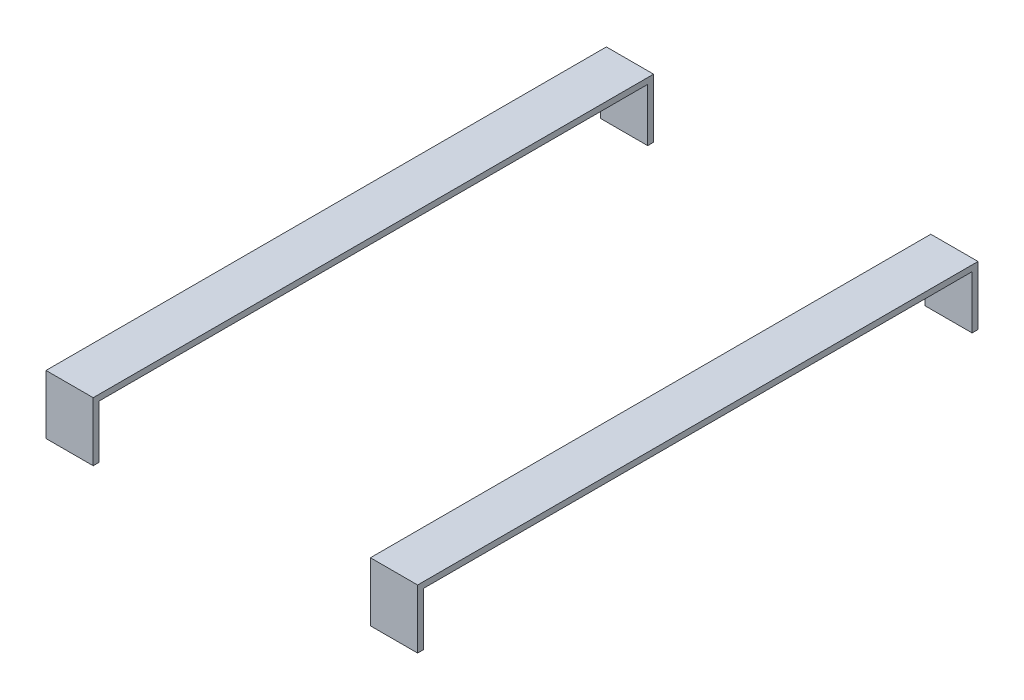
ISO-10303-21;
HEADER;
FILE_DESCRIPTION(('STEP AP214'),'2;1');
FILE_NAME('part.step','',(''),(''),'','','');
FILE_SCHEMA(('AUTOMOTIVE_DESIGN { 1 0 10303 214 1 1 1 1 }'));
ENDSEC;
DATA;
#1=APPLICATION_CONTEXT('core data for automotive mechanical design processes');
#2=APPLICATION_PROTOCOL_DEFINITION('international standard','automotive_design',2000,#1);
#3=PRODUCT_CONTEXT('',#1,'mechanical');
#4=PRODUCT('Part','Part','',(#3));
#5=PRODUCT_RELATED_PRODUCT_CATEGORY('part','',(#4));
#6=PRODUCT_DEFINITION_FORMATION('','',#4);
#7=PRODUCT_DEFINITION_CONTEXT('part definition',#1,'design');
#8=PRODUCT_DEFINITION('design','',#6,#7);
#9=PRODUCT_DEFINITION_SHAPE('','',#8);
#10=(LENGTH_UNIT() NAMED_UNIT(*) SI_UNIT(.MILLI.,.METRE.));
#11=(NAMED_UNIT(*) PLANE_ANGLE_UNIT() SI_UNIT($,.RADIAN.));
#12=(NAMED_UNIT(*) SI_UNIT($,.STERADIAN.) SOLID_ANGLE_UNIT());
#13=UNCERTAINTY_MEASURE_WITH_UNIT(LENGTH_MEASURE(1.E-05),#10,'distance_accuracy_value','');
#14=(GEOMETRIC_REPRESENTATION_CONTEXT(3) GLOBAL_UNCERTAINTY_ASSIGNED_CONTEXT((#13)) GLOBAL_UNIT_ASSIGNED_CONTEXT((#10,
#11,#12)) REPRESENTATION_CONTEXT('',''));
#15=CARTESIAN_POINT('',(0.,0.,0.));
#16=DIRECTION('',(0.,0.,1.));
#17=DIRECTION('',(1.,0.,0.));
#18=AXIS2_PLACEMENT_3D('',#15,#16,#17);
#19=CARTESIAN_POINT('',(470.,100.,10.));
#20=DIRECTION('',(0.,0.,-1.));
#21=DIRECTION('',(-1.,0.,0.));
#22=AXIS2_PLACEMENT_3D('',#19,#20,#21);
#23=PLANE('',#22);
#24=DIRECTION('',(1.,0.,0.));
#25=VECTOR('',#24,1.);
#26=CARTESIAN_POINT('',(470.,90.,10.));
#27=LINE('',#26,#25);
#28=CARTESIAN_POINT('',(470.,90.,10.));
#29=VERTEX_POINT('',#28);
#30=CARTESIAN_POINT('',(550.,90.,10.));
#31=VERTEX_POINT('',#30);
#32=EDGE_CURVE('E60',#29,#31,#27,.T.);
#33=ORIENTED_EDGE('',*,*,#32,.F.);
#34=DIRECTION('',(0.,-1.,0.));
#35=VECTOR('',#34,1.);
#36=CARTESIAN_POINT('',(470.,100.,10.));
#37=LINE('',#36,#35);
#38=CARTESIAN_POINT('',(470.,0.,10.));
#39=VERTEX_POINT('',#38);
#40=EDGE_CURVE('E95',#29,#39,#37,.T.);
#41=ORIENTED_EDGE('',*,*,#40,.T.);
#42=DIRECTION('',(1.,0.,0.));
#43=VECTOR('',#42,1.);
#44=CARTESIAN_POINT('',(470.,0.,10.));
#45=LINE('',#44,#43);
#46=CARTESIAN_POINT('',(550.,0.,10.));
#47=VERTEX_POINT('',#46);
#48=EDGE_CURVE('E99',#39,#47,#45,.T.);
#49=ORIENTED_EDGE('',*,*,#48,.T.);
#50=DIRECTION('',(0.,-1.,0.));
#51=VECTOR('',#50,1.);
#52=CARTESIAN_POINT('',(550.,100.,10.));
#53=LINE('',#52,#51);
#54=EDGE_CURVE('E87',#31,#47,#53,.T.);
#55=ORIENTED_EDGE('',*,*,#54,.F.);
#56=EDGE_LOOP('',(#33,#41,#49,#55));
#57=FACE_BOUND('',#56,.T.);
#58=ADVANCED_FACE('F45',(#57),#23,.F.);
#59=CARTESIAN_POINT('',(550.,100.,0.));
#60=DIRECTION('',(-1.,0.,0.));
#61=DIRECTION('',(0.,0.,1.));
#62=AXIS2_PLACEMENT_3D('',#59,#60,#61);
#63=PLANE('',#62);
#64=DIRECTION('',(0.,0.,-1.));
#65=VECTOR('',#64,1.);
#66=CARTESIAN_POINT('',(550.,0.,0.));
#67=LINE('',#66,#65);
#68=CARTESIAN_POINT('',(550.,0.,0.));
#69=VERTEX_POINT('',#68);
#70=EDGE_CURVE('E91',#47,#69,#67,.T.);
#71=ORIENTED_EDGE('',*,*,#70,.T.);
#72=DIRECTION('',(0.,-1.,0.));
#73=VECTOR('',#72,1.);
#74=CARTESIAN_POINT('',(550.,100.,0.));
#75=LINE('',#74,#73);
#76=CARTESIAN_POINT('',(550.,100.,0.));
#77=VERTEX_POINT('',#76);
#78=EDGE_CURVE('E12',#77,#69,#75,.T.);
#79=ORIENTED_EDGE('',*,*,#78,.F.);
#80=DIRECTION('',(0.,0.,-1.));
#81=VECTOR('',#80,1.);
#82=CARTESIAN_POINT('',(550.,100.,0.));
#83=LINE('',#82,#81);
#84=CARTESIAN_POINT('',(550.,100.,950.));
#85=VERTEX_POINT('',#84);
#86=EDGE_CURVE('E103',#85,#77,#83,.T.);
#87=ORIENTED_EDGE('',*,*,#86,.F.);
#88=DIRECTION('',(0.,-1.,0.));
#89=VECTOR('',#88,1.);
#90=CARTESIAN_POINT('',(550.,100.,950.));
#91=LINE('',#90,#89);
#92=CARTESIAN_POINT('',(550.,0.,950.));
#93=VERTEX_POINT('',#92);
#94=EDGE_CURVE('E131',#85,#93,#91,.T.);
#95=ORIENTED_EDGE('',*,*,#94,.T.);
#96=DIRECTION('',(0.,0.,-1.));
#97=VECTOR('',#96,1.);
#98=CARTESIAN_POINT('',(550.,0.,950.));
#99=LINE('',#98,#97);
#100=CARTESIAN_POINT('',(550.,0.,940.));
#101=VERTEX_POINT('',#100);
#102=EDGE_CURVE('E179',#93,#101,#99,.T.);
#103=ORIENTED_EDGE('',*,*,#102,.T.);
#104=DIRECTION('',(0.,-1.,0.));
#105=VECTOR('',#104,1.);
#106=CARTESIAN_POINT('',(550.,100.,940.));
#107=LINE('',#106,#105);
#108=CARTESIAN_POINT('',(550.,90.,940.));
#109=VERTEX_POINT('',#108);
#110=EDGE_CURVE('E149',#109,#101,#107,.T.);
#111=ORIENTED_EDGE('',*,*,#110,.F.);
#112=DIRECTION('',(0.,0.,-1.));
#113=VECTOR('',#112,1.);
#114=CARTESIAN_POINT('',(550.,90.,1020.62257748299));
#115=LINE('',#114,#113);
#116=EDGE_CURVE('E94',#109,#31,#115,.T.);
#117=ORIENTED_EDGE('',*,*,#116,.T.);
#118=ORIENTED_EDGE('',*,*,#54,.T.);
#119=EDGE_LOOP('',(#71,#79,#87,#95,#103,#111,#117,#118));
#120=FACE_BOUND('',#119,.T.);
#121=ADVANCED_FACE('F47',(#120),#63,.F.);
#122=CARTESIAN_POINT('',(470.,100.,0.));
#123=DIRECTION('',(0.,0.,1.));
#124=DIRECTION('',(1.,0.,0.));
#125=AXIS2_PLACEMENT_3D('',#122,#123,#124);
#126=PLANE('',#125);
#127=DIRECTION('',(-1.,0.,0.));
#128=VECTOR('',#127,1.);
#129=CARTESIAN_POINT('',(470.,0.,0.));
#130=LINE('',#129,#128);
#131=CARTESIAN_POINT('',(470.,0.,0.));
#132=VERTEX_POINT('',#131);
#133=EDGE_CURVE('E107',#69,#132,#130,.T.);
#134=ORIENTED_EDGE('',*,*,#133,.T.);
#135=DIRECTION('',(0.,-1.,0.));
#136=VECTOR('',#135,1.);
#137=CARTESIAN_POINT('',(470.,100.,0.));
#138=LINE('',#137,#136);
#139=CARTESIAN_POINT('',(470.,100.,0.));
#140=VERTEX_POINT('',#139);
#141=EDGE_CURVE('E53',#140,#132,#138,.T.);
#142=ORIENTED_EDGE('',*,*,#141,.F.);
#143=DIRECTION('',(-1.,0.,0.));
#144=VECTOR('',#143,1.);
#145=CARTESIAN_POINT('',(470.,100.,0.));
#146=LINE('',#145,#144);
#147=EDGE_CURVE('E69',#77,#140,#146,.T.);
#148=ORIENTED_EDGE('',*,*,#147,.F.);
#149=ORIENTED_EDGE('',*,*,#78,.T.);
#150=EDGE_LOOP('',(#134,#142,#148,#149));
#151=FACE_BOUND('',#150,.T.);
#152=ADVANCED_FACE('F123',(#151),#126,.F.);
#153=CARTESIAN_POINT('',(470.,100.,0.));
#154=DIRECTION('',(1.,0.,0.));
#155=DIRECTION('',(0.,0.,-1.));
#156=AXIS2_PLACEMENT_3D('',#153,#154,#155);
#157=PLANE('',#156);
#158=DIRECTION('',(0.,0.,1.));
#159=VECTOR('',#158,1.);
#160=CARTESIAN_POINT('',(470.,0.,0.));
#161=LINE('',#160,#159);
#162=EDGE_CURVE('E104',#132,#39,#161,.T.);
#163=ORIENTED_EDGE('',*,*,#162,.T.);
#164=ORIENTED_EDGE('',*,*,#40,.F.);
#165=DIRECTION('',(0.,0.,-1.));
#166=VECTOR('',#165,1.);
#167=CARTESIAN_POINT('',(470.,90.,1020.62257748299));
#168=LINE('',#167,#166);
#169=CARTESIAN_POINT('',(470.,90.,940.));
#170=VERTEX_POINT('',#169);
#171=EDGE_CURVE('E148',#170,#29,#168,.T.);
#172=ORIENTED_EDGE('',*,*,#171,.F.);
#173=DIRECTION('',(0.,-1.,0.));
#174=VECTOR('',#173,1.);
#175=CARTESIAN_POINT('',(470.,100.,940.));
#176=LINE('',#175,#174);
#177=CARTESIAN_POINT('',(470.,0.,940.));
#178=VERTEX_POINT('',#177);
#179=EDGE_CURVE('E154',#170,#178,#176,.T.);
#180=ORIENTED_EDGE('',*,*,#179,.T.);
#181=DIRECTION('',(0.,0.,1.));
#182=VECTOR('',#181,1.);
#183=CARTESIAN_POINT('',(470.,0.,950.));
#184=LINE('',#183,#182);
#185=CARTESIAN_POINT('',(470.,0.,950.));
#186=VERTEX_POINT('',#185);
#187=EDGE_CURVE('E143',#178,#186,#184,.T.);
#188=ORIENTED_EDGE('',*,*,#187,.T.);
#189=DIRECTION('',(0.,-1.,0.));
#190=VECTOR('',#189,1.);
#191=CARTESIAN_POINT('',(470.,100.,950.));
#192=LINE('',#191,#190);
#193=CARTESIAN_POINT('',(470.,100.,950.));
#194=VERTEX_POINT('',#193);
#195=EDGE_CURVE('E142',#194,#186,#192,.T.);
#196=ORIENTED_EDGE('',*,*,#195,.F.);
#197=DIRECTION('',(0.,0.,1.));
#198=VECTOR('',#197,1.);
#199=CARTESIAN_POINT('',(470.,100.,0.));
#200=LINE('',#199,#198);
#201=EDGE_CURVE('E96',#140,#194,#200,.T.);
#202=ORIENTED_EDGE('',*,*,#201,.F.);
#203=ORIENTED_EDGE('',*,*,#141,.T.);
#204=EDGE_LOOP('',(#163,#164,#172,#180,#188,#196,#202,#203));
#205=FACE_BOUND('',#204,.T.);
#206=ADVANCED_FACE('F120',(#205),#157,.F.);
#207=CARTESIAN_POINT('',(0.,100.,0.));
#208=DIRECTION('',(0.,1.,0.));
#209=DIRECTION('',(0.,0.,1.));
#210=AXIS2_PLACEMENT_3D('',#207,#208,#209);
#211=PLANE('',#210);
#212=ORIENTED_EDGE('',*,*,#86,.T.);
#213=ORIENTED_EDGE('',*,*,#147,.T.);
#214=ORIENTED_EDGE('',*,*,#201,.T.);
#215=DIRECTION('',(1.,0.,0.));
#216=VECTOR('',#215,1.);
#217=CARTESIAN_POINT('',(470.,100.,950.));
#218=LINE('',#217,#216);
#219=EDGE_CURVE('E138',#194,#85,#218,.T.);
#220=ORIENTED_EDGE('',*,*,#219,.T.);
#221=EDGE_LOOP('',(#212,#213,#214,#220));
#222=FACE_BOUND('',#221,.T.);
#223=ADVANCED_FACE('F139',(#222),#211,.T.);
#224=CARTESIAN_POINT('',(0.,0.,0.));
#225=DIRECTION('',(0.,1.,0.));
#226=DIRECTION('',(0.,0.,1.));
#227=AXIS2_PLACEMENT_3D('',#224,#225,#226);
#228=PLANE('',#227);
#229=ORIENTED_EDGE('',*,*,#70,.F.);
#230=ORIENTED_EDGE('',*,*,#48,.F.);
#231=ORIENTED_EDGE('',*,*,#162,.F.);
#232=ORIENTED_EDGE('',*,*,#133,.F.);
#233=EDGE_LOOP('',(#229,#230,#231,#232));
#234=FACE_BOUND('',#233,.T.);
#235=ADVANCED_FACE('F106',(#234),#228,.F.);
#236=CARTESIAN_POINT('',(470.,90.,1020.62257748299));
#237=DIRECTION('',(0.,1.,0.));
#238=DIRECTION('',(-1.,0.,0.));
#239=AXIS2_PLACEMENT_3D('',#236,#237,#238);
#240=PLANE('',#239);
#241=DIRECTION('',(1.,0.,0.));
#242=VECTOR('',#241,1.);
#243=CARTESIAN_POINT('',(470.,90.,940.));
#244=LINE('',#243,#242);
#245=EDGE_CURVE('E108',#170,#109,#244,.T.);
#246=ORIENTED_EDGE('',*,*,#245,.F.);
#247=ORIENTED_EDGE('',*,*,#171,.T.);
#248=ORIENTED_EDGE('',*,*,#32,.T.);
#249=ORIENTED_EDGE('',*,*,#116,.F.);
#250=EDGE_LOOP('',(#246,#247,#248,#249));
#251=FACE_BOUND('',#250,.T.);
#252=ADVANCED_FACE('F161',(#251),#240,.F.);
#253=CARTESIAN_POINT('',(470.,100.,940.));
#254=DIRECTION('',(0.,0.,1.));
#255=DIRECTION('',(1.,0.,0.));
#256=AXIS2_PLACEMENT_3D('',#253,#254,#255);
#257=PLANE('',#256);
#258=ORIENTED_EDGE('',*,*,#179,.F.);
#259=ORIENTED_EDGE('',*,*,#245,.T.);
#260=ORIENTED_EDGE('',*,*,#110,.T.);
#261=DIRECTION('',(-1.,0.,0.));
#262=VECTOR('',#261,1.);
#263=CARTESIAN_POINT('',(470.,0.,940.));
#264=LINE('',#263,#262);
#265=EDGE_CURVE('E183',#101,#178,#264,.T.);
#266=ORIENTED_EDGE('',*,*,#265,.T.);
#267=EDGE_LOOP('',(#258,#259,#260,#266));
#268=FACE_BOUND('',#267,.T.);
#269=ADVANCED_FACE('F191',(#268),#257,.F.);
#270=CARTESIAN_POINT('',(470.,100.,950.));
#271=DIRECTION('',(0.,0.,-1.));
#272=DIRECTION('',(-1.,0.,0.));
#273=AXIS2_PLACEMENT_3D('',#270,#271,#272);
#274=PLANE('',#273);
#275=DIRECTION('',(1.,0.,0.));
#276=VECTOR('',#275,1.);
#277=CARTESIAN_POINT('',(470.,0.,950.));
#278=LINE('',#277,#276);
#279=EDGE_CURVE('E147',#186,#93,#278,.T.);
#280=ORIENTED_EDGE('',*,*,#279,.T.);
#281=ORIENTED_EDGE('',*,*,#94,.F.);
#282=ORIENTED_EDGE('',*,*,#219,.F.);
#283=ORIENTED_EDGE('',*,*,#195,.T.);
#284=EDGE_LOOP('',(#280,#281,#282,#283));
#285=FACE_BOUND('',#284,.T.);
#286=ADVANCED_FACE('F145',(#285),#274,.F.);
#287=CARTESIAN_POINT('',(0.,0.,0.));
#288=DIRECTION('',(0.,1.,0.));
#289=DIRECTION('',(0.,0.,1.));
#290=AXIS2_PLACEMENT_3D('',#287,#288,#289);
#291=PLANE('',#290);
#292=ORIENTED_EDGE('',*,*,#279,.F.);
#293=ORIENTED_EDGE('',*,*,#187,.F.);
#294=ORIENTED_EDGE('',*,*,#265,.F.);
#295=ORIENTED_EDGE('',*,*,#102,.F.);
#296=EDGE_LOOP('',(#292,#293,#294,#295));
#297=FACE_BOUND('',#296,.T.);
#298=ADVANCED_FACE('F180',(#297),#291,.F.);
#299=CLOSED_SHELL('',(#58,#121,#152,#206,#223,#235,#252,#269,#286,#298));
#300=MANIFOLD_SOLID_BREP('B2',#299);
#301=CARTESIAN_POINT('',(0.,100.,10.));
#302=DIRECTION('',(0.,0.,-1.));
#303=DIRECTION('',(-1.,0.,0.));
#304=AXIS2_PLACEMENT_3D('',#301,#302,#303);
#305=PLANE('',#304);
#306=DIRECTION('',(1.,0.,0.));
#307=VECTOR('',#306,1.);
#308=CARTESIAN_POINT('',(-80.,90.,10.));
#309=LINE('',#308,#307);
#310=CARTESIAN_POINT('',(-80.,90.,10.));
#311=VERTEX_POINT('',#310);
#312=CARTESIAN_POINT('',(0.,90.,10.));
#313=VERTEX_POINT('',#312);
#314=EDGE_CURVE('E306',#311,#313,#309,.T.);
#315=ORIENTED_EDGE('',*,*,#314,.F.);
#316=DIRECTION('',(0.,-1.,0.));
#317=VECTOR('',#316,1.);
#318=CARTESIAN_POINT('',(-80.,100.,10.));
#319=LINE('',#318,#317);
#320=CARTESIAN_POINT('',(-80.,0.,10.));
#321=VERTEX_POINT('',#320);
#322=EDGE_CURVE('E341',#311,#321,#319,.T.);
#323=ORIENTED_EDGE('',*,*,#322,.T.);
#324=DIRECTION('',(1.,0.,0.));
#325=VECTOR('',#324,1.);
#326=CARTESIAN_POINT('',(0.,0.,10.));
#327=LINE('',#326,#325);
#328=CARTESIAN_POINT('',(0.,0.,10.));
#329=VERTEX_POINT('',#328);
#330=EDGE_CURVE('E345',#321,#329,#327,.T.);
#331=ORIENTED_EDGE('',*,*,#330,.T.);
#332=DIRECTION('',(0.,-1.,0.));
#333=VECTOR('',#332,1.);
#334=CARTESIAN_POINT('',(0.,100.,10.));
#335=LINE('',#334,#333);
#336=EDGE_CURVE('E333',#313,#329,#335,.T.);
#337=ORIENTED_EDGE('',*,*,#336,.F.);
#338=EDGE_LOOP('',(#315,#323,#331,#337));
#339=FACE_BOUND('',#338,.T.);
#340=ADVANCED_FACE('F291',(#339),#305,.F.);
#341=CARTESIAN_POINT('',(0.,100.,0.));
#342=DIRECTION('',(-1.,0.,0.));
#343=DIRECTION('',(0.,0.,1.));
#344=AXIS2_PLACEMENT_3D('',#341,#342,#343);
#345=PLANE('',#344);
#346=DIRECTION('',(0.,0.,-1.));
#347=VECTOR('',#346,1.);
#348=CARTESIAN_POINT('',(0.,0.,0.));
#349=LINE('',#348,#347);
#350=CARTESIAN_POINT('',(0.,0.,0.));
#351=VERTEX_POINT('',#350);
#352=EDGE_CURVE('E337',#329,#351,#349,.T.);
#353=ORIENTED_EDGE('',*,*,#352,.T.);
#354=DIRECTION('',(0.,-1.,0.));
#355=VECTOR('',#354,1.);
#356=CARTESIAN_POINT('',(0.,100.,0.));
#357=LINE('',#356,#355);
#358=CARTESIAN_POINT('',(0.,100.,0.));
#359=VERTEX_POINT('',#358);
#360=EDGE_CURVE('E43',#359,#351,#357,.T.);
#361=ORIENTED_EDGE('',*,*,#360,.F.);
#362=DIRECTION('',(0.,0.,-1.));
#363=VECTOR('',#362,1.);
#364=CARTESIAN_POINT('',(0.,100.,0.));
#365=LINE('',#364,#363);
#366=CARTESIAN_POINT('',(0.,100.,950.));
#367=VERTEX_POINT('',#366);
#368=EDGE_CURVE('E349',#367,#359,#365,.T.);
#369=ORIENTED_EDGE('',*,*,#368,.F.);
#370=DIRECTION('',(0.,-1.,0.));
#371=VECTOR('',#370,1.);
#372=CARTESIAN_POINT('',(0.,100.,950.));
#373=LINE('',#372,#371);
#374=CARTESIAN_POINT('',(0.,0.,950.));
#375=VERTEX_POINT('',#374);
#376=EDGE_CURVE('E377',#367,#375,#373,.T.);
#377=ORIENTED_EDGE('',*,*,#376,.T.);
#378=DIRECTION('',(0.,0.,-1.));
#379=VECTOR('',#378,1.);
#380=CARTESIAN_POINT('',(0.,0.,950.));
#381=LINE('',#380,#379);
#382=CARTESIAN_POINT('',(0.,0.,940.));
#383=VERTEX_POINT('',#382);
#384=EDGE_CURVE('E425',#375,#383,#381,.T.);
#385=ORIENTED_EDGE('',*,*,#384,.T.);
#386=DIRECTION('',(0.,-1.,0.));
#387=VECTOR('',#386,1.);
#388=CARTESIAN_POINT('',(0.,100.,940.));
#389=LINE('',#388,#387);
#390=CARTESIAN_POINT('',(0.,90.,940.));
#391=VERTEX_POINT('',#390);
#392=EDGE_CURVE('E395',#391,#383,#389,.T.);
#393=ORIENTED_EDGE('',*,*,#392,.F.);
#394=DIRECTION('',(0.,0.,-1.));
#395=VECTOR('',#394,1.);
#396=CARTESIAN_POINT('',(0.,90.,1020.62257748299));
#397=LINE('',#396,#395);
#398=EDGE_CURVE('E340',#391,#313,#397,.T.);
#399=ORIENTED_EDGE('',*,*,#398,.T.);
#400=ORIENTED_EDGE('',*,*,#336,.T.);
#401=EDGE_LOOP('',(#353,#361,#369,#377,#385,#393,#399,#400));
#402=FACE_BOUND('',#401,.T.);
#403=ADVANCED_FACE('F293',(#402),#345,.F.);
#404=CARTESIAN_POINT('',(0.,100.,0.));
#405=DIRECTION('',(0.,0.,1.));
#406=DIRECTION('',(1.,0.,0.));
#407=AXIS2_PLACEMENT_3D('',#404,#405,#406);
#408=PLANE('',#407);
#409=DIRECTION('',(-1.,0.,0.));
#410=VECTOR('',#409,1.);
#411=CARTESIAN_POINT('',(0.,0.,0.));
#412=LINE('',#411,#410);
#413=CARTESIAN_POINT('',(-80.,0.,0.));
#414=VERTEX_POINT('',#413);
#415=EDGE_CURVE('E353',#351,#414,#412,.T.);
#416=ORIENTED_EDGE('',*,*,#415,.T.);
#417=DIRECTION('',(0.,-1.,0.));
#418=VECTOR('',#417,1.);
#419=CARTESIAN_POINT('',(-80.,100.,0.));
#420=LINE('',#419,#418);
#421=CARTESIAN_POINT('',(-80.,100.,0.));
#422=VERTEX_POINT('',#421);
#423=EDGE_CURVE('E299',#422,#414,#420,.T.);
#424=ORIENTED_EDGE('',*,*,#423,.F.);
#425=DIRECTION('',(-1.,0.,0.));
#426=VECTOR('',#425,1.);
#427=CARTESIAN_POINT('',(0.,100.,0.));
#428=LINE('',#427,#426);
#429=EDGE_CURVE('E315',#359,#422,#428,.T.);
#430=ORIENTED_EDGE('',*,*,#429,.F.);
#431=ORIENTED_EDGE('',*,*,#360,.T.);
#432=EDGE_LOOP('',(#416,#424,#430,#431));
#433=FACE_BOUND('',#432,.T.);
#434=ADVANCED_FACE('F369',(#433),#408,.F.);
#435=CARTESIAN_POINT('',(-80.,100.,0.));
#436=DIRECTION('',(1.,0.,0.));
#437=DIRECTION('',(0.,0.,-1.));
#438=AXIS2_PLACEMENT_3D('',#435,#436,#437);
#439=PLANE('',#438);
#440=DIRECTION('',(0.,0.,1.));
#441=VECTOR('',#440,1.);
#442=CARTESIAN_POINT('',(-80.,0.,0.));
#443=LINE('',#442,#441);
#444=EDGE_CURVE('E350',#414,#321,#443,.T.);
#445=ORIENTED_EDGE('',*,*,#444,.T.);
#446=ORIENTED_EDGE('',*,*,#322,.F.);
#447=DIRECTION('',(0.,0.,-1.));
#448=VECTOR('',#447,1.);
#449=CARTESIAN_POINT('',(-80.,90.,1020.62257748299));
#450=LINE('',#449,#448);
#451=CARTESIAN_POINT('',(-80.,90.,940.));
#452=VERTEX_POINT('',#451);
#453=EDGE_CURVE('E394',#452,#311,#450,.T.);
#454=ORIENTED_EDGE('',*,*,#453,.F.);
#455=DIRECTION('',(0.,-1.,0.));
#456=VECTOR('',#455,1.);
#457=CARTESIAN_POINT('',(-80.,100.,940.));
#458=LINE('',#457,#456);
#459=CARTESIAN_POINT('',(-80.,0.,940.));
#460=VERTEX_POINT('',#459);
#461=EDGE_CURVE('E400',#452,#460,#458,.T.);
#462=ORIENTED_EDGE('',*,*,#461,.T.);
#463=DIRECTION('',(0.,0.,1.));
#464=VECTOR('',#463,1.);
#465=CARTESIAN_POINT('',(-80.,0.,950.));
#466=LINE('',#465,#464);
#467=CARTESIAN_POINT('',(-80.,0.,950.));
#468=VERTEX_POINT('',#467);
#469=EDGE_CURVE('E389',#460,#468,#466,.T.);
#470=ORIENTED_EDGE('',*,*,#469,.T.);
#471=DIRECTION('',(0.,-1.,0.));
#472=VECTOR('',#471,1.);
#473=CARTESIAN_POINT('',(-80.,100.,950.));
#474=LINE('',#473,#472);
#475=CARTESIAN_POINT('',(-80.,100.,950.));
#476=VERTEX_POINT('',#475);
#477=EDGE_CURVE('E388',#476,#468,#474,.T.);
#478=ORIENTED_EDGE('',*,*,#477,.F.);
#479=DIRECTION('',(0.,0.,1.));
#480=VECTOR('',#479,1.);
#481=CARTESIAN_POINT('',(-80.,100.,0.));
#482=LINE('',#481,#480);
#483=EDGE_CURVE('E342',#422,#476,#482,.T.);
#484=ORIENTED_EDGE('',*,*,#483,.F.);
#485=ORIENTED_EDGE('',*,*,#423,.T.);
#486=EDGE_LOOP('',(#445,#446,#454,#462,#470,#478,#484,#485));
#487=FACE_BOUND('',#486,.T.);
#488=ADVANCED_FACE('F366',(#487),#439,.F.);
#489=CARTESIAN_POINT('',(0.,100.,0.));
#490=DIRECTION('',(0.,-1.,0.));
#491=DIRECTION('',(0.,0.,-1.));
#492=AXIS2_PLACEMENT_3D('',#489,#490,#491);
#493=PLANE('',#492);
#494=ORIENTED_EDGE('',*,*,#368,.T.);
#495=ORIENTED_EDGE('',*,*,#429,.T.);
#496=ORIENTED_EDGE('',*,*,#483,.T.);
#497=DIRECTION('',(1.,0.,0.));
#498=VECTOR('',#497,1.);
#499=CARTESIAN_POINT('',(0.,100.,950.));
#500=LINE('',#499,#498);
#501=EDGE_CURVE('E384',#476,#367,#500,.T.);
#502=ORIENTED_EDGE('',*,*,#501,.T.);
#503=EDGE_LOOP('',(#494,#495,#496,#502));
#504=FACE_BOUND('',#503,.T.);
#505=ADVANCED_FACE('F385',(#504),#493,.F.);
#506=CARTESIAN_POINT('',(0.,0.,0.));
#507=DIRECTION('',(0.,-1.,0.));
#508=DIRECTION('',(0.,0.,-1.));
#509=AXIS2_PLACEMENT_3D('',#506,#507,#508);
#510=PLANE('',#509);
#511=ORIENTED_EDGE('',*,*,#352,.F.);
#512=ORIENTED_EDGE('',*,*,#330,.F.);
#513=ORIENTED_EDGE('',*,*,#444,.F.);
#514=ORIENTED_EDGE('',*,*,#415,.F.);
#515=EDGE_LOOP('',(#511,#512,#513,#514));
#516=FACE_BOUND('',#515,.T.);
#517=ADVANCED_FACE('F352',(#516),#510,.T.);
#518=CARTESIAN_POINT('',(-80.,90.,1020.62257748299));
#519=DIRECTION('',(0.,1.,0.));
#520=DIRECTION('',(0.,0.,1.));
#521=AXIS2_PLACEMENT_3D('',#518,#519,#520);
#522=PLANE('',#521);
#523=DIRECTION('',(1.,0.,0.));
#524=VECTOR('',#523,1.);
#525=CARTESIAN_POINT('',(-80.,90.,940.));
#526=LINE('',#525,#524);
#527=EDGE_CURVE('E354',#452,#391,#526,.T.);
#528=ORIENTED_EDGE('',*,*,#527,.F.);
#529=ORIENTED_EDGE('',*,*,#453,.T.);
#530=ORIENTED_EDGE('',*,*,#314,.T.);
#531=ORIENTED_EDGE('',*,*,#398,.F.);
#532=EDGE_LOOP('',(#528,#529,#530,#531));
#533=FACE_BOUND('',#532,.T.);
#534=ADVANCED_FACE('F407',(#533),#522,.F.);
#535=CARTESIAN_POINT('',(0.,100.,940.));
#536=DIRECTION('',(0.,0.,1.));
#537=DIRECTION('',(1.,0.,0.));
#538=AXIS2_PLACEMENT_3D('',#535,#536,#537);
#539=PLANE('',#538);
#540=ORIENTED_EDGE('',*,*,#461,.F.);
#541=ORIENTED_EDGE('',*,*,#527,.T.);
#542=ORIENTED_EDGE('',*,*,#392,.T.);
#543=DIRECTION('',(-1.,0.,0.));
#544=VECTOR('',#543,1.);
#545=CARTESIAN_POINT('',(0.,0.,940.));
#546=LINE('',#545,#544);
#547=EDGE_CURVE('E429',#383,#460,#546,.T.);
#548=ORIENTED_EDGE('',*,*,#547,.T.);
#549=EDGE_LOOP('',(#540,#541,#542,#548));
#550=FACE_BOUND('',#549,.T.);
#551=ADVANCED_FACE('F437',(#550),#539,.F.);
#552=CARTESIAN_POINT('',(0.,100.,950.));
#553=DIRECTION('',(0.,0.,-1.));
#554=DIRECTION('',(-1.,0.,0.));
#555=AXIS2_PLACEMENT_3D('',#552,#553,#554);
#556=PLANE('',#555);
#557=DIRECTION('',(1.,0.,0.));
#558=VECTOR('',#557,1.);
#559=CARTESIAN_POINT('',(0.,0.,950.));
#560=LINE('',#559,#558);
#561=EDGE_CURVE('E393',#468,#375,#560,.T.);
#562=ORIENTED_EDGE('',*,*,#561,.T.);
#563=ORIENTED_EDGE('',*,*,#376,.F.);
#564=ORIENTED_EDGE('',*,*,#501,.F.);
#565=ORIENTED_EDGE('',*,*,#477,.T.);
#566=EDGE_LOOP('',(#562,#563,#564,#565));
#567=FACE_BOUND('',#566,.T.);
#568=ADVANCED_FACE('F391',(#567),#556,.F.);
#569=CARTESIAN_POINT('',(0.,0.,0.));
#570=DIRECTION('',(0.,-1.,0.));
#571=DIRECTION('',(0.,0.,-1.));
#572=AXIS2_PLACEMENT_3D('',#569,#570,#571);
#573=PLANE('',#572);
#574=ORIENTED_EDGE('',*,*,#561,.F.);
#575=ORIENTED_EDGE('',*,*,#469,.F.);
#576=ORIENTED_EDGE('',*,*,#547,.F.);
#577=ORIENTED_EDGE('',*,*,#384,.F.);
#578=EDGE_LOOP('',(#574,#575,#576,#577));
#579=FACE_BOUND('',#578,.T.);
#580=ADVANCED_FACE('F426',(#579),#573,.T.);
#581=CLOSED_SHELL('',(#340,#403,#434,#488,#505,#517,#534,#551,#568,#580));
#582=MANIFOLD_SOLID_BREP('B6',#581);
#583=ADVANCED_BREP_SHAPE_REPRESENTATION('',(#18,#300,#582),#14);
#584=SHAPE_DEFINITION_REPRESENTATION(#9,#583);
ENDSEC;
END-ISO-10303-21;
